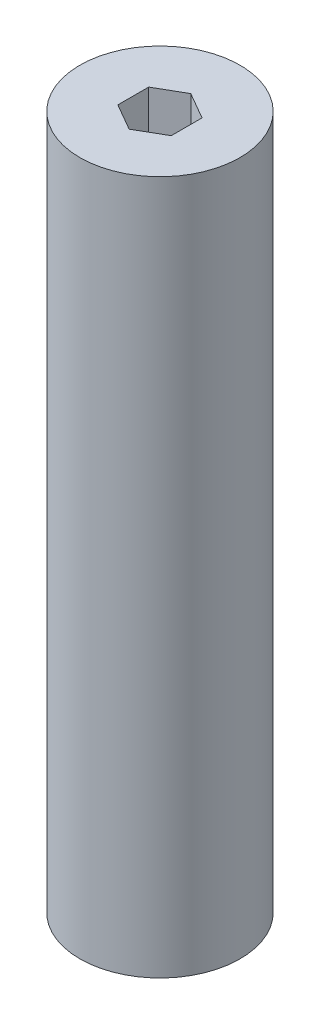
ISO-10303-21;
HEADER;
FILE_DESCRIPTION(('STEP AP214'),'2;1');
FILE_NAME('part.step','',(''),(''),'','','');
FILE_SCHEMA(('AUTOMOTIVE_DESIGN { 1 0 10303 214 1 1 1 1 }'));
ENDSEC;
DATA;
#1=APPLICATION_CONTEXT('core data for automotive mechanical design processes');
#2=APPLICATION_PROTOCOL_DEFINITION('international standard','automotive_design',2000,#1);
#3=PRODUCT_CONTEXT('',#1,'mechanical');
#4=PRODUCT('Part','Part','',(#3));
#5=PRODUCT_RELATED_PRODUCT_CATEGORY('part','',(#4));
#6=PRODUCT_DEFINITION_FORMATION('','',#4);
#7=PRODUCT_DEFINITION_CONTEXT('part definition',#1,'design');
#8=PRODUCT_DEFINITION('design','',#6,#7);
#9=PRODUCT_DEFINITION_SHAPE('','',#8);
#10=(LENGTH_UNIT() NAMED_UNIT(*) SI_UNIT(.MILLI.,.METRE.));
#11=(NAMED_UNIT(*) PLANE_ANGLE_UNIT() SI_UNIT($,.RADIAN.));
#12=(NAMED_UNIT(*) SI_UNIT($,.STERADIAN.) SOLID_ANGLE_UNIT());
#13=UNCERTAINTY_MEASURE_WITH_UNIT(LENGTH_MEASURE(1.E-05),#10,'distance_accuracy_value','');
#14=(GEOMETRIC_REPRESENTATION_CONTEXT(3) GLOBAL_UNCERTAINTY_ASSIGNED_CONTEXT((#13)) GLOBAL_UNIT_ASSIGNED_CONTEXT((#10,
#11,#12)) REPRESENTATION_CONTEXT('',''));
#15=CARTESIAN_POINT('',(0.,0.,0.));
#16=DIRECTION('',(0.,0.,1.));
#17=DIRECTION('',(1.,0.,0.));
#18=AXIS2_PLACEMENT_3D('',#15,#16,#17);
#19=CARTESIAN_POINT('',(0.,165.1,0.));
#20=DIRECTION('',(0.,-1.,0.));
#21=DIRECTION('',(0.,0.,-1.));
#22=AXIS2_PLACEMENT_3D('',#19,#20,#21);
#23=CYLINDRICAL_SURFACE('',#22,19.05);
#24=CARTESIAN_POINT('',(0.,165.1,0.));
#25=DIRECTION('',(0.,1.,0.));
#26=DIRECTION('',(0.,0.,1.));
#27=AXIS2_PLACEMENT_3D('',#24,#25,#26);
#28=CIRCLE('',#27,19.05);
#29=CARTESIAN_POINT('',(0.,165.1,19.05));
#30=VERTEX_POINT('',#29);
#31=EDGE_CURVE('E11',#30,#30,#28,.T.);
#32=ORIENTED_EDGE('',*,*,#31,.F.);
#33=EDGE_LOOP('',(#32));
#34=FACE_BOUND('',#33,.T.);
#35=CARTESIAN_POINT('',(0.,0.,0.));
#36=DIRECTION('',(0.,1.,0.));
#37=DIRECTION('',(0.,0.,1.));
#38=AXIS2_PLACEMENT_3D('',#35,#36,#37);
#39=CIRCLE('',#38,19.05);
#40=CARTESIAN_POINT('',(0.,0.,19.05));
#41=VERTEX_POINT('',#40);
#42=EDGE_CURVE('E36',#41,#41,#39,.T.);
#43=ORIENTED_EDGE('',*,*,#42,.T.);
#44=EDGE_LOOP('',(#43));
#45=FACE_BOUND('',#44,.T.);
#46=ADVANCED_FACE('F33',(#34,#45),#23,.T.);
#47=CARTESIAN_POINT('',(0.,165.1,0.));
#48=DIRECTION('',(0.,1.,0.));
#49=DIRECTION('',(0.,0.,1.));
#50=AXIS2_PLACEMENT_3D('',#47,#48,#49);
#51=PLANE('',#50);
#52=DIRECTION('',(-0.866025403784439,0.,-0.5));
#53=VECTOR('',#52,1.);
#54=CARTESIAN_POINT('',(6.35,165.1,-3.66617420935413));
#55=LINE('',#54,#53);
#56=CARTESIAN_POINT('',(6.35,165.1,-3.66617420935413));
#57=VERTEX_POINT('',#56);
#58=CARTESIAN_POINT('',(0.,165.1,-7.33234841870824));
#59=VERTEX_POINT('',#58);
#60=EDGE_CURVE('E47',#57,#59,#55,.T.);
#61=ORIENTED_EDGE('',*,*,#60,.F.);
#62=DIRECTION('',(0.,0.,-1.));
#63=VECTOR('',#62,1.);
#64=CARTESIAN_POINT('',(6.35,165.1,3.66617420935412));
#65=LINE('',#64,#63);
#66=CARTESIAN_POINT('',(6.35,165.1,3.66617420935412));
#67=VERTEX_POINT('',#66);
#68=EDGE_CURVE('E113',#67,#57,#65,.T.);
#69=ORIENTED_EDGE('',*,*,#68,.F.);
#70=DIRECTION('',(0.866025403784438,0.,-0.5));
#71=VECTOR('',#70,1.);
#72=CARTESIAN_POINT('',(0.,165.1,7.33234841870825));
#73=LINE('',#72,#71);
#74=CARTESIAN_POINT('',(0.,165.1,7.33234841870825));
#75=VERTEX_POINT('',#74);
#76=EDGE_CURVE('E107',#75,#67,#73,.T.);
#77=ORIENTED_EDGE('',*,*,#76,.F.);
#78=DIRECTION('',(0.866025403784439,0.,0.5));
#79=VECTOR('',#78,1.);
#80=CARTESIAN_POINT('',(-6.35,165.1,3.66617420935413));
#81=LINE('',#80,#79);
#82=CARTESIAN_POINT('',(-6.35,165.1,3.66617420935413));
#83=VERTEX_POINT('',#82);
#84=EDGE_CURVE('E105',#83,#75,#81,.T.);
#85=ORIENTED_EDGE('',*,*,#84,.F.);
#86=DIRECTION('',(0.,0.,1.));
#87=VECTOR('',#86,1.);
#88=CARTESIAN_POINT('',(-6.35,165.1,-3.66617420935412));
#89=LINE('',#88,#87);
#90=CARTESIAN_POINT('',(-6.35,165.1,-3.66617420935412));
#91=VERTEX_POINT('',#90);
#92=EDGE_CURVE('E88',#91,#83,#89,.T.);
#93=ORIENTED_EDGE('',*,*,#92,.F.);
#94=DIRECTION('',(-0.866025403784438,0.,0.5));
#95=VECTOR('',#94,1.);
#96=CARTESIAN_POINT('',(0.,165.1,-7.33234841870825));
#97=LINE('',#96,#95);
#98=EDGE_CURVE('E97',#59,#91,#97,.T.);
#99=ORIENTED_EDGE('',*,*,#98,.F.);
#100=EDGE_LOOP('',(#61,#69,#77,#85,#93,#99));
#101=FACE_BOUND('',#100,.T.);
#102=ORIENTED_EDGE('',*,*,#31,.T.);
#103=EDGE_LOOP('',(#102));
#104=FACE_BOUND('',#103,.T.);
#105=ADVANCED_FACE('F101',(#101,#104),#51,.T.);
#106=CARTESIAN_POINT('',(0.,0.,0.));
#107=DIRECTION('',(0.,1.,0.));
#108=DIRECTION('',(0.,0.,1.));
#109=AXIS2_PLACEMENT_3D('',#106,#107,#108);
#110=PLANE('',#109);
#111=DIRECTION('',(0.,0.,1.));
#112=VECTOR('',#111,1.);
#113=CARTESIAN_POINT('',(6.35,0.,3.66617420935412));
#114=LINE('',#113,#112);
#115=CARTESIAN_POINT('',(6.35,0.,-3.66617420935413));
#116=VERTEX_POINT('',#115);
#117=CARTESIAN_POINT('',(6.35,0.,3.66617420935412));
#118=VERTEX_POINT('',#117);
#119=EDGE_CURVE('E127',#116,#118,#114,.T.);
#120=ORIENTED_EDGE('',*,*,#119,.F.);
#121=DIRECTION('',(0.866025403784439,0.,0.5));
#122=VECTOR('',#121,1.);
#123=CARTESIAN_POINT('',(6.35,0.,-3.66617420935413));
#124=LINE('',#123,#122);
#125=CARTESIAN_POINT('',(0.,0.,-7.33234841870825));
#126=VERTEX_POINT('',#125);
#127=EDGE_CURVE('E125',#126,#116,#124,.T.);
#128=ORIENTED_EDGE('',*,*,#127,.F.);
#129=DIRECTION('',(0.866025403784439,0.,-0.5));
#130=VECTOR('',#129,1.);
#131=CARTESIAN_POINT('',(0.,0.,-7.33234841870825));
#132=LINE('',#131,#130);
#133=CARTESIAN_POINT('',(-6.35,0.,-3.66617420935412));
#134=VERTEX_POINT('',#133);
#135=EDGE_CURVE('E124',#134,#126,#132,.T.);
#136=ORIENTED_EDGE('',*,*,#135,.F.);
#137=DIRECTION('',(0.,0.,-1.));
#138=VECTOR('',#137,1.);
#139=CARTESIAN_POINT('',(-6.35,0.,-3.66617420935412));
#140=LINE('',#139,#138);
#141=CARTESIAN_POINT('',(-6.35,0.,3.66617420935413));
#142=VERTEX_POINT('',#141);
#143=EDGE_CURVE('E91',#142,#134,#140,.T.);
#144=ORIENTED_EDGE('',*,*,#143,.F.);
#145=DIRECTION('',(-0.866025403784439,0.,-0.5));
#146=VECTOR('',#145,1.);
#147=CARTESIAN_POINT('',(-6.35,0.,3.66617420935413));
#148=LINE('',#147,#146);
#149=CARTESIAN_POINT('',(0.,0.,7.33234841870825));
#150=VERTEX_POINT('',#149);
#151=EDGE_CURVE('E135',#150,#142,#148,.T.);
#152=ORIENTED_EDGE('',*,*,#151,.F.);
#153=DIRECTION('',(-0.866025403784439,0.,0.5));
#154=VECTOR('',#153,1.);
#155=CARTESIAN_POINT('',(0.,0.,7.33234841870825));
#156=LINE('',#155,#154);
#157=EDGE_CURVE('E131',#118,#150,#156,.T.);
#158=ORIENTED_EDGE('',*,*,#157,.F.);
#159=EDGE_LOOP('',(#120,#128,#136,#144,#152,#158));
#160=FACE_BOUND('',#159,.T.);
#161=ORIENTED_EDGE('',*,*,#42,.F.);
#162=EDGE_LOOP('',(#161));
#163=FACE_BOUND('',#162,.T.);
#164=ADVANCED_FACE('F144',(#160,#163),#110,.F.);
#165=CARTESIAN_POINT('',(6.35,-19.3995704419797,-3.66617420935413));
#166=DIRECTION('',(0.5,0.,-0.866025403784439));
#167=DIRECTION('',(-0.866025403784439,0.,-0.5));
#168=AXIS2_PLACEMENT_3D('',#165,#166,#167);
#169=PLANE('',#168);
#170=ORIENTED_EDGE('',*,*,#127,.T.);
#171=DIRECTION('',(0.,1.,0.));
#172=VECTOR('',#171,1.);
#173=CARTESIAN_POINT('',(6.35,-19.3995704419797,-3.66617420935413));
#174=LINE('',#173,#172);
#175=EDGE_CURVE('E116',#116,#57,#174,.T.);
#176=ORIENTED_EDGE('',*,*,#175,.T.);
#177=ORIENTED_EDGE('',*,*,#60,.T.);
#178=DIRECTION('',(0.,1.,0.));
#179=VECTOR('',#178,1.);
#180=CARTESIAN_POINT('',(0.,-19.3995704419797,-7.33234841870825));
#181=LINE('',#180,#179);
#182=EDGE_CURVE('E94',#126,#59,#181,.T.);
#183=ORIENTED_EDGE('',*,*,#182,.F.);
#184=EDGE_LOOP('',(#170,#176,#177,#183));
#185=FACE_BOUND('',#184,.T.);
#186=ADVANCED_FACE('F159',(#185),#169,.F.);
#187=CARTESIAN_POINT('',(6.35,-19.3995704419797,3.66617420935412));
#188=DIRECTION('',(1.,0.,0.));
#189=DIRECTION('',(0.,0.,-1.));
#190=AXIS2_PLACEMENT_3D('',#187,#188,#189);
#191=PLANE('',#190);
#192=ORIENTED_EDGE('',*,*,#119,.T.);
#193=DIRECTION('',(0.,1.,0.));
#194=VECTOR('',#193,1.);
#195=CARTESIAN_POINT('',(6.35,-19.3995704419797,3.66617420935412));
#196=LINE('',#195,#194);
#197=EDGE_CURVE('E118',#118,#67,#196,.T.);
#198=ORIENTED_EDGE('',*,*,#197,.T.);
#199=ORIENTED_EDGE('',*,*,#68,.T.);
#200=ORIENTED_EDGE('',*,*,#175,.F.);
#201=EDGE_LOOP('',(#192,#198,#199,#200));
#202=FACE_BOUND('',#201,.T.);
#203=ADVANCED_FACE('F148',(#202),#191,.F.);
#204=CARTESIAN_POINT('',(0.,-19.3995704419797,7.33234841870825));
#205=DIRECTION('',(0.5,0.,0.866025403784439));
#206=DIRECTION('',(0.866025403784439,0.,-0.5));
#207=AXIS2_PLACEMENT_3D('',#204,#205,#206);
#208=PLANE('',#207);
#209=ORIENTED_EDGE('',*,*,#157,.T.);
#210=DIRECTION('',(0.,1.,0.));
#211=VECTOR('',#210,1.);
#212=CARTESIAN_POINT('',(0.,-19.3995704419797,7.33234841870825));
#213=LINE('',#212,#211);
#214=EDGE_CURVE('E120',#150,#75,#213,.T.);
#215=ORIENTED_EDGE('',*,*,#214,.T.);
#216=ORIENTED_EDGE('',*,*,#76,.T.);
#217=ORIENTED_EDGE('',*,*,#197,.F.);
#218=EDGE_LOOP('',(#209,#215,#216,#217));
#219=FACE_BOUND('',#218,.T.);
#220=ADVANCED_FACE('F150',(#219),#208,.F.);
#221=CARTESIAN_POINT('',(-6.35,-19.3995704419797,3.66617420935413));
#222=DIRECTION('',(-0.5,0.,0.866025403784439));
#223=DIRECTION('',(0.866025403784439,0.,0.5));
#224=AXIS2_PLACEMENT_3D('',#221,#222,#223);
#225=PLANE('',#224);
#226=ORIENTED_EDGE('',*,*,#151,.T.);
#227=DIRECTION('',(0.,1.,0.));
#228=VECTOR('',#227,1.);
#229=CARTESIAN_POINT('',(-6.35,-19.3995704419797,3.66617420935413));
#230=LINE('',#229,#228);
#231=EDGE_CURVE('E93',#142,#83,#230,.T.);
#232=ORIENTED_EDGE('',*,*,#231,.T.);
#233=ORIENTED_EDGE('',*,*,#84,.T.);
#234=ORIENTED_EDGE('',*,*,#214,.F.);
#235=EDGE_LOOP('',(#226,#232,#233,#234));
#236=FACE_BOUND('',#235,.T.);
#237=ADVANCED_FACE('F140',(#236),#225,.F.);
#238=CARTESIAN_POINT('',(-6.35,-19.3995704419797,-3.66617420935412));
#239=DIRECTION('',(-1.,0.,0.));
#240=DIRECTION('',(0.,0.,1.));
#241=AXIS2_PLACEMENT_3D('',#238,#239,#240);
#242=PLANE('',#241);
#243=ORIENTED_EDGE('',*,*,#143,.T.);
#244=DIRECTION('',(0.,1.,0.));
#245=VECTOR('',#244,1.);
#246=CARTESIAN_POINT('',(-6.35,-19.3995704419797,-3.66617420935412));
#247=LINE('',#246,#245);
#248=EDGE_CURVE('E55',#134,#91,#247,.T.);
#249=ORIENTED_EDGE('',*,*,#248,.T.);
#250=ORIENTED_EDGE('',*,*,#92,.T.);
#251=ORIENTED_EDGE('',*,*,#231,.F.);
#252=EDGE_LOOP('',(#243,#249,#250,#251));
#253=FACE_BOUND('',#252,.T.);
#254=ADVANCED_FACE('F85',(#253),#242,.F.);
#255=CARTESIAN_POINT('',(0.,-19.3995704419797,-7.33234841870825));
#256=DIRECTION('',(-0.5,0.,-0.866025403784439));
#257=DIRECTION('',(-0.866025403784439,0.,0.5));
#258=AXIS2_PLACEMENT_3D('',#255,#256,#257);
#259=PLANE('',#258);
#260=ORIENTED_EDGE('',*,*,#135,.T.);
#261=ORIENTED_EDGE('',*,*,#182,.T.);
#262=ORIENTED_EDGE('',*,*,#98,.T.);
#263=ORIENTED_EDGE('',*,*,#248,.F.);
#264=EDGE_LOOP('',(#260,#261,#262,#263));
#265=FACE_BOUND('',#264,.T.);
#266=ADVANCED_FACE('F98',(#265),#259,.F.);
#267=CLOSED_SHELL('',(#46,#105,#164,#186,#203,#220,#237,#254,#266));
#268=MANIFOLD_SOLID_BREP('B2',#267);
#269=ADVANCED_BREP_SHAPE_REPRESENTATION('',(#18,#268),#14);
#270=SHAPE_DEFINITION_REPRESENTATION(#9,#269);
ENDSEC;
END-ISO-10303-21;
